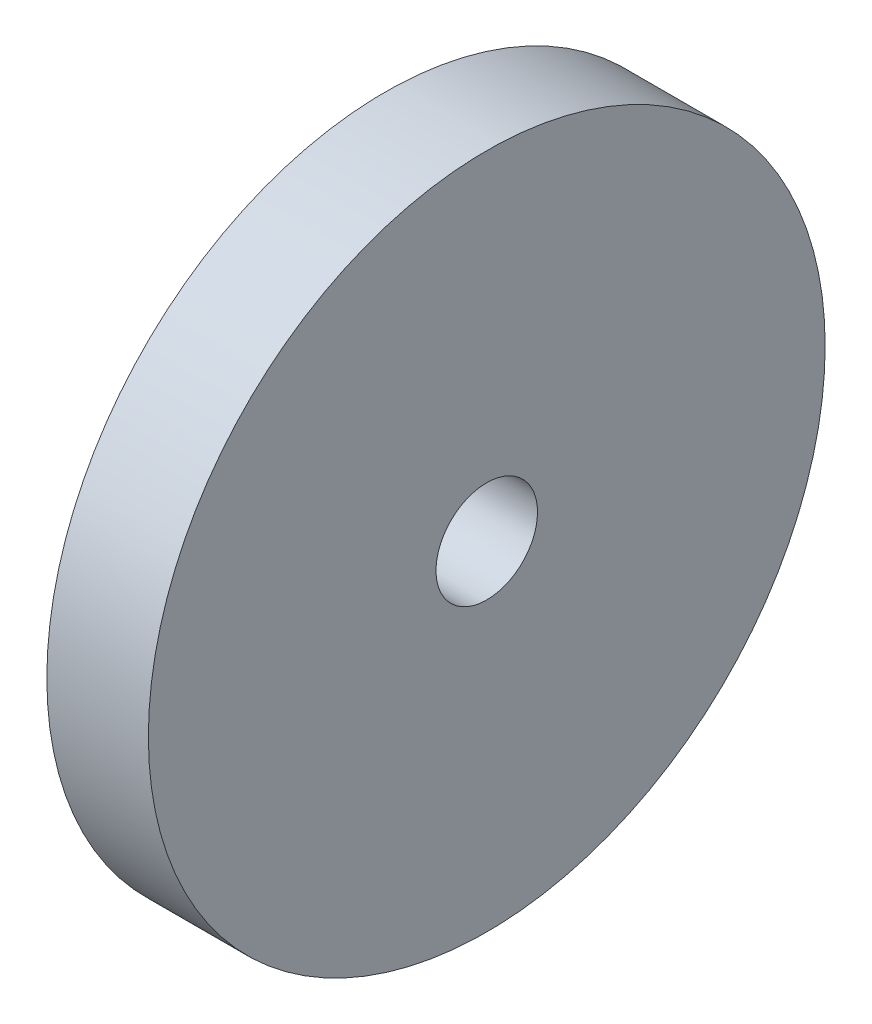
ISO-10303-21;
HEADER;
FILE_DESCRIPTION(('STEP AP214'),'2;1');
FILE_NAME('part.step','',(''),(''),'','','');
FILE_SCHEMA(('AUTOMOTIVE_DESIGN { 1 0 10303 214 1 1 1 1 }'));
ENDSEC;
DATA;
#1=APPLICATION_CONTEXT('core data for automotive mechanical design processes');
#2=APPLICATION_PROTOCOL_DEFINITION('international standard','automotive_design',2000,#1);
#3=PRODUCT_CONTEXT('',#1,'mechanical');
#4=PRODUCT('Part','Part','',(#3));
#5=PRODUCT_RELATED_PRODUCT_CATEGORY('part','',(#4));
#6=PRODUCT_DEFINITION_FORMATION('','',#4);
#7=PRODUCT_DEFINITION_CONTEXT('part definition',#1,'design');
#8=PRODUCT_DEFINITION('design','',#6,#7);
#9=PRODUCT_DEFINITION_SHAPE('','',#8);
#10=(LENGTH_UNIT() NAMED_UNIT(*) SI_UNIT(.MILLI.,.METRE.));
#11=(NAMED_UNIT(*) PLANE_ANGLE_UNIT() SI_UNIT($,.RADIAN.));
#12=(NAMED_UNIT(*) SI_UNIT($,.STERADIAN.) SOLID_ANGLE_UNIT());
#13=UNCERTAINTY_MEASURE_WITH_UNIT(LENGTH_MEASURE(1.E-05),#10,'distance_accuracy_value','');
#14=(GEOMETRIC_REPRESENTATION_CONTEXT(3) GLOBAL_UNCERTAINTY_ASSIGNED_CONTEXT((#13)) GLOBAL_UNIT_ASSIGNED_CONTEXT((#10,
#11,#12)) REPRESENTATION_CONTEXT('',''));
#15=CARTESIAN_POINT('',(0.,0.,0.));
#16=DIRECTION('',(0.,0.,1.));
#17=DIRECTION('',(1.,0.,0.));
#18=AXIS2_PLACEMENT_3D('',#15,#16,#17);
#19=CARTESIAN_POINT('',(4.7625,0.,0.));
#20=DIRECTION('',(-1.,0.,0.));
#21=DIRECTION('',(0.,0.,1.));
#22=AXIS2_PLACEMENT_3D('',#19,#20,#21);
#23=CYLINDRICAL_SURFACE('',#22,15.875);
#24=CARTESIAN_POINT('',(4.7625,0.,0.));
#25=DIRECTION('',(1.,0.,0.));
#26=DIRECTION('',(0.,0.,-1.));
#27=AXIS2_PLACEMENT_3D('',#24,#25,#26);
#28=CIRCLE('',#27,15.875);
#29=CARTESIAN_POINT('',(4.7625,0.,15.875));
#30=VERTEX_POINT('',#29);
#31=EDGE_CURVE('E10',#30,#30,#28,.T.);
#32=CARTESIAN_POINT('',(0.,0.,0.));
#33=DIRECTION('',(1.,0.,0.));
#34=DIRECTION('',(0.,0.,-1.));
#35=AXIS2_PLACEMENT_3D('',#32,#33,#34);
#36=CIRCLE('',#35,15.875);
#37=CARTESIAN_POINT('',(0.,0.,15.875));
#38=VERTEX_POINT('',#37);
#39=EDGE_CURVE('E33',#38,#38,#36,.T.);
#40=CARTESIAN_POINT('',(4.7625,0.,15.875));
#41=CARTESIAN_POINT('',(4.712890625,0.,15.875));
#42=CARTESIAN_POINT('',(4.66328125,0.,15.875));
#43=CARTESIAN_POINT('',(4.5640625,0.,15.875));
#44=CARTESIAN_POINT('',(4.514453125,0.,15.875));
#45=CARTESIAN_POINT('',(4.415234375,0.,15.875));
#46=CARTESIAN_POINT('',(4.365625,0.,15.875));
#47=CARTESIAN_POINT('',(4.26640625,0.,15.875));
#48=CARTESIAN_POINT('',(4.216796875,0.,15.875));
#49=CARTESIAN_POINT('',(4.117578125,0.,15.875));
#50=CARTESIAN_POINT('',(4.06796875,0.,15.875));
#51=CARTESIAN_POINT('',(3.96875,0.,15.875));
#52=CARTESIAN_POINT('',(3.919140625,0.,15.875));
#53=CARTESIAN_POINT('',(3.819921875,0.,15.875));
#54=CARTESIAN_POINT('',(3.7703125,0.,15.875));
#55=CARTESIAN_POINT('',(3.67109375,0.,15.875));
#56=CARTESIAN_POINT('',(3.621484375,0.,15.875));
#57=CARTESIAN_POINT('',(3.522265625,0.,15.875));
#58=CARTESIAN_POINT('',(3.47265625,0.,15.875));
#59=CARTESIAN_POINT('',(3.3734375,0.,15.875));
#60=CARTESIAN_POINT('',(3.323828125,0.,15.875));
#61=CARTESIAN_POINT('',(3.224609375,0.,15.875));
#62=CARTESIAN_POINT('',(3.175,0.,15.875));
#63=CARTESIAN_POINT('',(3.07578125,0.,15.875));
#64=CARTESIAN_POINT('',(3.026171875,0.,15.875));
#65=CARTESIAN_POINT('',(2.926953125,0.,15.875));
#66=CARTESIAN_POINT('',(2.87734375,0.,15.875));
#67=CARTESIAN_POINT('',(2.778125,0.,15.875));
#68=CARTESIAN_POINT('',(2.728515625,0.,15.875));
#69=CARTESIAN_POINT('',(2.629296875,0.,15.875));
#70=CARTESIAN_POINT('',(2.5796875,0.,15.875));
#71=CARTESIAN_POINT('',(2.48046875,0.,15.875));
#72=CARTESIAN_POINT('',(2.430859375,0.,15.875));
#73=CARTESIAN_POINT('',(2.331640625,0.,15.875));
#74=CARTESIAN_POINT('',(2.28203125,0.,15.875));
#75=CARTESIAN_POINT('',(2.1828125,0.,15.875));
#76=CARTESIAN_POINT('',(2.133203125,0.,15.875));
#77=CARTESIAN_POINT('',(2.033984375,0.,15.875));
#78=CARTESIAN_POINT('',(1.984375,0.,15.875));
#79=CARTESIAN_POINT('',(1.88515625,0.,15.875));
#80=CARTESIAN_POINT('',(1.835546875,0.,15.875));
#81=CARTESIAN_POINT('',(1.736328125,0.,15.875));
#82=CARTESIAN_POINT('',(1.68671875,0.,15.875));
#83=CARTESIAN_POINT('',(1.5875,0.,15.875));
#84=CARTESIAN_POINT('',(1.537890625,0.,15.875));
#85=CARTESIAN_POINT('',(1.438671875,0.,15.875));
#86=CARTESIAN_POINT('',(1.3890625,0.,15.875));
#87=CARTESIAN_POINT('',(1.28984375,0.,15.875));
#88=CARTESIAN_POINT('',(1.240234375,0.,15.875));
#89=CARTESIAN_POINT('',(1.141015625,0.,15.875));
#90=CARTESIAN_POINT('',(1.09140625,0.,15.875));
#91=CARTESIAN_POINT('',(0.992187499999999,0.,15.875));
#92=CARTESIAN_POINT('',(0.942578124999999,0.,15.875));
#93=CARTESIAN_POINT('',(0.843359375,0.,15.875));
#94=CARTESIAN_POINT('',(0.79375,0.,15.875));
#95=CARTESIAN_POINT('',(0.69453125,0.,15.875));
#96=CARTESIAN_POINT('',(0.644921875,0.,15.875));
#97=CARTESIAN_POINT('',(0.545703125,0.,15.875));
#98=CARTESIAN_POINT('',(0.49609375,0.,15.875));
#99=CARTESIAN_POINT('',(0.396875,0.,15.875));
#100=CARTESIAN_POINT('',(0.347265625,0.,15.875));
#101=CARTESIAN_POINT('',(0.248046875,0.,15.875));
#102=CARTESIAN_POINT('',(0.1984375,0.,15.875));
#103=CARTESIAN_POINT('',(0.09921875,0.,15.875));
#104=CARTESIAN_POINT('',(0.049609375,0.,15.875));
#105=CARTESIAN_POINT('',(0.,0.,15.875));
#106=B_SPLINE_CURVE_WITH_KNOTS('',3,(#40,#41,#42,#43,#44,#45,#46,#47,#48,#49,#50,#51,#52,#53,
#54,#55,#56,#57,#58,#59,#60,#61,#62,#63,#64,#65,#66,#67,#68,#69,#70,#71,#72,#73,#74,#75,#76,#77,
#78,#79,#80,#81,#82,#83,#84,#85,#86,#87,#88,#89,#90,#91,#92,#93,#94,#95,#96,#97,#98,#99,#100,
#101,#102,#103,#104,#105),.UNSPECIFIED.,.F.,.F.,(4,2,2,2,2,2,2,2,2,2,2,2,2,2,2,2,2,2,2,2,2,2,2,
2,2,2,2,2,2,2,2,2,4),(0.,0.148828125,0.29765625,0.446484375,0.5953125,0.744140625,
0.892968750000001,1.041796875,1.190625,1.339453125,1.48828125,1.637109375,1.7859375,1.934765625,
2.08359375,2.232421875,2.38125,2.530078125,2.67890625,2.827734375,2.9765625,3.125390625,
3.27421875,3.423046875,3.571875,3.720703125,3.86953125,4.018359375,4.1671875,4.316015625,
4.46484375,4.613671875,4.7625),.UNSPECIFIED.);
#107=EDGE_CURVE('BSEAM30',#30,#38,#106,.T.);
#108=ORIENTED_EDGE('',*,*,#31,.F.);
#109=ORIENTED_EDGE('',*,*,#39,.T.);
#110=ORIENTED_EDGE('',*,*,#107,.T.);
#111=ORIENTED_EDGE('',*,*,#107,.F.);
#112=EDGE_LOOP('',(#108,#110,#109,#111));
#113=FACE_BOUND('',#112,.T.);
#114=ADVANCED_FACE('F30',(#113),#23,.T.);
#115=CARTESIAN_POINT('',(4.7625,0.,0.));
#116=DIRECTION('',(1.,0.,0.));
#117=DIRECTION('',(0.,0.,-1.));
#118=AXIS2_PLACEMENT_3D('',#115,#116,#117);
#119=PLANE('',#118);
#120=CARTESIAN_POINT('',(4.7625,0.,0.));
#121=DIRECTION('',(1.,0.,0.));
#122=DIRECTION('',(0.,0.,-1.));
#123=AXIS2_PLACEMENT_3D('',#120,#121,#122);
#124=CIRCLE('',#123,2.38125);
#125=CARTESIAN_POINT('',(4.7625,0.,-2.38125));
#126=VERTEX_POINT('',#125);
#127=EDGE_CURVE('E40',#126,#126,#124,.T.);
#128=ORIENTED_EDGE('',*,*,#127,.F.);
#129=EDGE_LOOP('',(#128));
#130=FACE_BOUND('',#129,.T.);
#131=ORIENTED_EDGE('',*,*,#31,.T.);
#132=EDGE_LOOP('',(#131));
#133=FACE_BOUND('',#132,.T.);
#134=ADVANCED_FACE('F58',(#130,#133),#119,.T.);
#135=CARTESIAN_POINT('',(0.,0.,0.));
#136=DIRECTION('',(1.,0.,0.));
#137=DIRECTION('',(0.,0.,-1.));
#138=AXIS2_PLACEMENT_3D('',#135,#136,#137);
#139=PLANE('',#138);
#140=CARTESIAN_POINT('',(0.,0.,0.));
#141=DIRECTION('',(1.,0.,0.));
#142=DIRECTION('',(0.,0.,-1.));
#143=AXIS2_PLACEMENT_3D('',#140,#141,#142);
#144=CIRCLE('',#143,2.38125);
#145=CARTESIAN_POINT('',(0.,0.,-2.38125));
#146=VERTEX_POINT('',#145);
#147=EDGE_CURVE('E44',#146,#146,#144,.T.);
#148=ORIENTED_EDGE('',*,*,#147,.T.);
#149=EDGE_LOOP('',(#148));
#150=FACE_BOUND('',#149,.T.);
#151=ORIENTED_EDGE('',*,*,#39,.F.);
#152=EDGE_LOOP('',(#151));
#153=FACE_BOUND('',#152,.T.);
#154=ADVANCED_FACE('F48',(#150,#153),#139,.F.);
#155=CARTESIAN_POINT('',(0.,0.,0.));
#156=DIRECTION('',(1.,0.,0.));
#157=DIRECTION('',(0.,0.,-1.));
#158=AXIS2_PLACEMENT_3D('',#155,#156,#157);
#159=CYLINDRICAL_SURFACE('',#158,2.38125);
#160=CARTESIAN_POINT('',(4.7625,0.,-2.38125));
#161=CARTESIAN_POINT('',(4.712890625,0.,-2.38125));
#162=CARTESIAN_POINT('',(4.66328125,0.,-2.38125));
#163=CARTESIAN_POINT('',(4.5640625,0.,-2.38125));
#164=CARTESIAN_POINT('',(4.514453125,0.,-2.38125));
#165=CARTESIAN_POINT('',(4.415234375,0.,-2.38125));
#166=CARTESIAN_POINT('',(4.365625,0.,-2.38125));
#167=CARTESIAN_POINT('',(4.26640625,0.,-2.38125));
#168=CARTESIAN_POINT('',(4.216796875,0.,-2.38125));
#169=CARTESIAN_POINT('',(4.117578125,0.,-2.38125));
#170=CARTESIAN_POINT('',(4.06796875,0.,-2.38125));
#171=CARTESIAN_POINT('',(3.96875,0.,-2.38125));
#172=CARTESIAN_POINT('',(3.919140625,0.,-2.38125));
#173=CARTESIAN_POINT('',(3.819921875,0.,-2.38125));
#174=CARTESIAN_POINT('',(3.7703125,0.,-2.38125));
#175=CARTESIAN_POINT('',(3.67109375,0.,-2.38125));
#176=CARTESIAN_POINT('',(3.621484375,0.,-2.38125));
#177=CARTESIAN_POINT('',(3.522265625,0.,-2.38125));
#178=CARTESIAN_POINT('',(3.47265625,0.,-2.38125));
#179=CARTESIAN_POINT('',(3.3734375,0.,-2.38125));
#180=CARTESIAN_POINT('',(3.323828125,0.,-2.38125));
#181=CARTESIAN_POINT('',(3.224609375,0.,-2.38125));
#182=CARTESIAN_POINT('',(3.175,0.,-2.38125));
#183=CARTESIAN_POINT('',(3.07578125,0.,-2.38125));
#184=CARTESIAN_POINT('',(3.026171875,0.,-2.38125));
#185=CARTESIAN_POINT('',(2.926953125,0.,-2.38125));
#186=CARTESIAN_POINT('',(2.87734375,0.,-2.38125));
#187=CARTESIAN_POINT('',(2.778125,0.,-2.38125));
#188=CARTESIAN_POINT('',(2.728515625,0.,-2.38125));
#189=CARTESIAN_POINT('',(2.629296875,0.,-2.38125));
#190=CARTESIAN_POINT('',(2.5796875,0.,-2.38125));
#191=CARTESIAN_POINT('',(2.48046875,0.,-2.38125));
#192=CARTESIAN_POINT('',(2.430859375,0.,-2.38125));
#193=CARTESIAN_POINT('',(2.331640625,0.,-2.38125));
#194=CARTESIAN_POINT('',(2.28203125,0.,-2.38125));
#195=CARTESIAN_POINT('',(2.1828125,0.,-2.38125));
#196=CARTESIAN_POINT('',(2.133203125,0.,-2.38125));
#197=CARTESIAN_POINT('',(2.033984375,0.,-2.38125));
#198=CARTESIAN_POINT('',(1.984375,0.,-2.38125));
#199=CARTESIAN_POINT('',(1.88515625,0.,-2.38125));
#200=CARTESIAN_POINT('',(1.835546875,0.,-2.38125));
#201=CARTESIAN_POINT('',(1.736328125,0.,-2.38125));
#202=CARTESIAN_POINT('',(1.68671875,0.,-2.38125));
#203=CARTESIAN_POINT('',(1.5875,0.,-2.38125));
#204=CARTESIAN_POINT('',(1.537890625,0.,-2.38125));
#205=CARTESIAN_POINT('',(1.438671875,0.,-2.38125));
#206=CARTESIAN_POINT('',(1.3890625,0.,-2.38125));
#207=CARTESIAN_POINT('',(1.28984375,0.,-2.38125));
#208=CARTESIAN_POINT('',(1.240234375,0.,-2.38125));
#209=CARTESIAN_POINT('',(1.141015625,0.,-2.38125));
#210=CARTESIAN_POINT('',(1.09140625,0.,-2.38125));
#211=CARTESIAN_POINT('',(0.9921875,0.,-2.38125));
#212=CARTESIAN_POINT('',(0.942578125,0.,-2.38125));
#213=CARTESIAN_POINT('',(0.843359375,0.,-2.38125));
#214=CARTESIAN_POINT('',(0.79375,0.,-2.38125));
#215=CARTESIAN_POINT('',(0.69453125,0.,-2.38125));
#216=CARTESIAN_POINT('',(0.644921875,0.,-2.38125));
#217=CARTESIAN_POINT('',(0.545703125,0.,-2.38125));
#218=CARTESIAN_POINT('',(0.49609375,0.,-2.38125));
#219=CARTESIAN_POINT('',(0.396875,0.,-2.38125));
#220=CARTESIAN_POINT('',(0.347265625,0.,-2.38125));
#221=CARTESIAN_POINT('',(0.248046875,0.,-2.38125));
#222=CARTESIAN_POINT('',(0.1984375,0.,-2.38125));
#223=CARTESIAN_POINT('',(0.0992187500000001,0.,-2.38125));
#224=CARTESIAN_POINT('',(0.0496093750000001,0.,-2.38125));
#225=CARTESIAN_POINT('',(0.,0.,-2.38125));
#226=B_SPLINE_CURVE_WITH_KNOTS('',3,(#160,#161,#162,#163,#164,#165,#166,#167,#168,#169,#170,
#171,#172,#173,#174,#175,#176,#177,#178,#179,#180,#181,#182,#183,#184,#185,#186,#187,#188,#189,
#190,#191,#192,#193,#194,#195,#196,#197,#198,#199,#200,#201,#202,#203,#204,#205,#206,#207,#208,
#209,#210,#211,#212,#213,#214,#215,#216,#217,#218,#219,#220,#221,#222,#223,#224,#225),
.UNSPECIFIED.,.F.,.F.,(4,2,2,2,2,2,2,2,2,2,2,2,2,2,2,2,2,2,2,2,2,2,2,2,2,2,2,2,2,2,2,2,4),(0.,
0.148828125,0.29765625,0.446484375,0.5953125,0.744140625,0.89296875,1.041796875,1.190625,
1.339453125,1.48828125,1.637109375,1.7859375,1.934765625,2.08359375,2.232421875,2.38125,
2.530078125,2.67890625,2.827734375,2.9765625,3.125390625,3.27421875,3.423046875,3.571875,
3.720703125,3.86953125,4.018359375,4.1671875,4.316015625,4.46484375,4.613671875,4.7625),.UNSPECIFIED.);
#227=EDGE_CURVE('BSEAM51',#126,#146,#226,.T.);
#228=ORIENTED_EDGE('',*,*,#127,.T.);
#229=ORIENTED_EDGE('',*,*,#147,.F.);
#230=ORIENTED_EDGE('',*,*,#227,.T.);
#231=ORIENTED_EDGE('',*,*,#227,.F.);
#232=EDGE_LOOP('',(#228,#230,#229,#231));
#233=FACE_BOUND('',#232,.T.);
#234=ADVANCED_FACE('F51',(#233),#159,.F.);
#235=CLOSED_SHELL('',(#114,#134,#154,#234));
#236=MANIFOLD_SOLID_BREP('B2',#235);
#237=ADVANCED_BREP_SHAPE_REPRESENTATION('',(#18,#236),#14);
#238=SHAPE_DEFINITION_REPRESENTATION(#9,#237);
ENDSEC;
END-ISO-10303-21;
